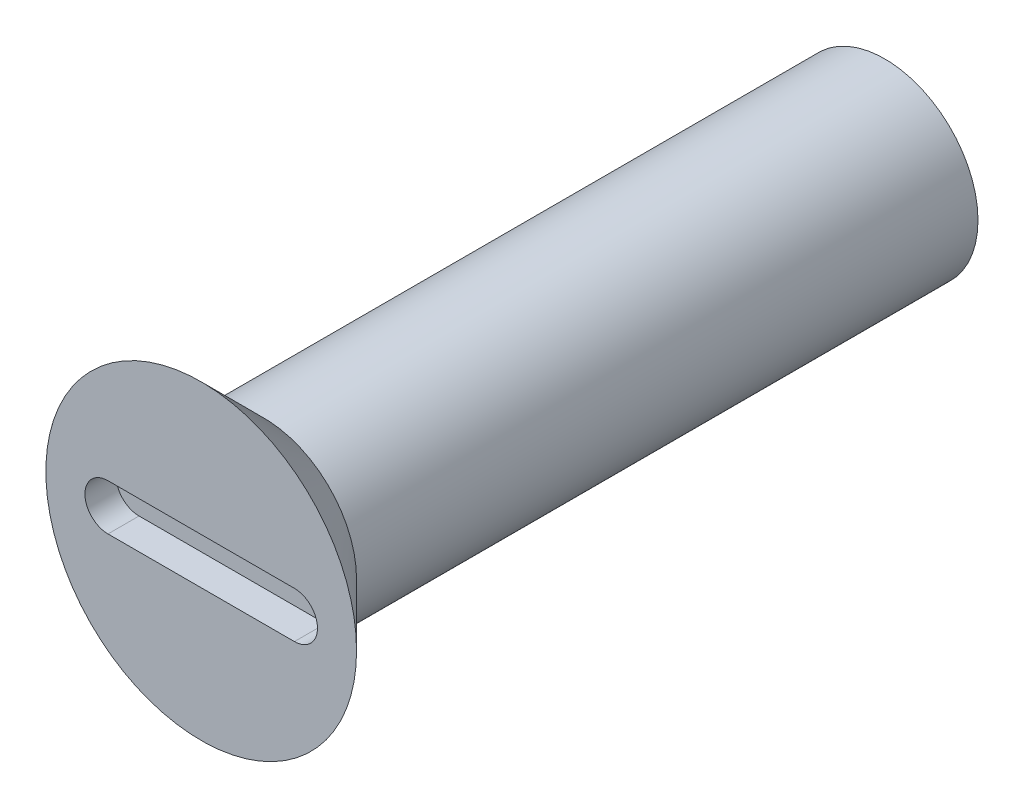
ISO-10303-21;
HEADER;
FILE_DESCRIPTION(('STEP AP214'),'2;1');
FILE_NAME('part.step','',(''),(''),'','','');
FILE_SCHEMA(('AUTOMOTIVE_DESIGN { 1 0 10303 214 1 1 1 1 }'));
ENDSEC;
DATA;
#1=APPLICATION_CONTEXT('core data for automotive mechanical design processes');
#2=APPLICATION_PROTOCOL_DEFINITION('international standard','automotive_design',2000,#1);
#3=PRODUCT_CONTEXT('',#1,'mechanical');
#4=PRODUCT('Part','Part','',(#3));
#5=PRODUCT_RELATED_PRODUCT_CATEGORY('part','',(#4));
#6=PRODUCT_DEFINITION_FORMATION('','',#4);
#7=PRODUCT_DEFINITION_CONTEXT('part definition',#1,'design');
#8=PRODUCT_DEFINITION('design','',#6,#7);
#9=PRODUCT_DEFINITION_SHAPE('','',#8);
#10=(LENGTH_UNIT() NAMED_UNIT(*) SI_UNIT(.MILLI.,.METRE.));
#11=(NAMED_UNIT(*) PLANE_ANGLE_UNIT() SI_UNIT($,.RADIAN.));
#12=(NAMED_UNIT(*) SI_UNIT($,.STERADIAN.) SOLID_ANGLE_UNIT());
#13=UNCERTAINTY_MEASURE_WITH_UNIT(LENGTH_MEASURE(1.E-05),#10,'distance_accuracy_value','');
#14=(GEOMETRIC_REPRESENTATION_CONTEXT(3) GLOBAL_UNCERTAINTY_ASSIGNED_CONTEXT((#13)) GLOBAL_UNIT_ASSIGNED_CONTEXT((#10,
#11,#12)) REPRESENTATION_CONTEXT('',''));
#15=CARTESIAN_POINT('',(0.,0.,0.));
#16=DIRECTION('',(0.,0.,1.));
#17=DIRECTION('',(1.,0.,0.));
#18=AXIS2_PLACEMENT_3D('',#15,#16,#17);
#19=CARTESIAN_POINT('',(0.,0.,10.));
#20=DIRECTION('',(0.,0.,-1.));
#21=DIRECTION('',(-1.,0.,0.));
#22=AXIS2_PLACEMENT_3D('',#19,#20,#21);
#23=CYLINDRICAL_SURFACE('',#22,1.5);
#24=CARTESIAN_POINT('',(0.,0.,10.));
#25=DIRECTION('',(0.,0.,1.));
#26=DIRECTION('',(1.,0.,0.));
#27=AXIS2_PLACEMENT_3D('',#24,#25,#26);
#28=CIRCLE('',#27,1.5);
#29=CARTESIAN_POINT('',(1.5,0.,10.));
#30=VERTEX_POINT('',#29);
#31=EDGE_CURVE('E11',#30,#30,#28,.T.);
#32=ORIENTED_EDGE('',*,*,#31,.F.);
#33=EDGE_LOOP('',(#32));
#34=FACE_BOUND('',#33,.T.);
#35=CARTESIAN_POINT('',(0.,0.,0.));
#36=DIRECTION('',(0.,0.,1.));
#37=DIRECTION('',(1.,0.,0.));
#38=AXIS2_PLACEMENT_3D('',#35,#36,#37);
#39=CIRCLE('',#38,1.5);
#40=CARTESIAN_POINT('',(1.5,0.,0.));
#41=VERTEX_POINT('',#40);
#42=EDGE_CURVE('E48',#41,#41,#39,.T.);
#43=ORIENTED_EDGE('',*,*,#42,.T.);
#44=EDGE_LOOP('',(#43));
#45=FACE_BOUND('',#44,.T.);
#46=ADVANCED_FACE('F45',(#34,#45),#23,.T.);
#47=CARTESIAN_POINT('',(0.,0.,0.));
#48=DIRECTION('',(0.,0.,1.));
#49=DIRECTION('',(1.,0.,0.));
#50=AXIS2_PLACEMENT_3D('',#47,#48,#49);
#51=PLANE('',#50);
#52=ORIENTED_EDGE('',*,*,#42,.F.);
#53=EDGE_LOOP('',(#52));
#54=FACE_BOUND('',#53,.T.);
#55=ADVANCED_FACE('F130',(#54),#51,.F.);
#56=CARTESIAN_POINT('',(0.,0.,10.));
#57=DIRECTION('',(0.,0.,1.));
#58=DIRECTION('',(1.,0.,0.));
#59=AXIS2_PLACEMENT_3D('',#56,#57,#58);
#60=CONICAL_SURFACE('',#59,1.5,0.785398163397454);
#61=CARTESIAN_POINT('',(0.,0.,11.));
#62=DIRECTION('',(0.,0.,1.));
#63=DIRECTION('',(1.,0.,0.));
#64=AXIS2_PLACEMENT_3D('',#61,#62,#63);
#65=CIRCLE('',#64,2.5);
#66=CARTESIAN_POINT('',(2.5,0.,11.));
#67=VERTEX_POINT('',#66);
#68=EDGE_CURVE('E120',#67,#67,#65,.T.);
#69=ORIENTED_EDGE('',*,*,#68,.F.);
#70=EDGE_LOOP('',(#69));
#71=FACE_BOUND('',#70,.T.);
#72=ORIENTED_EDGE('',*,*,#31,.T.);
#73=EDGE_LOOP('',(#72));
#74=FACE_BOUND('',#73,.T.);
#75=ADVANCED_FACE('F132',(#71,#74),#60,.T.);
#76=CARTESIAN_POINT('',(-2.5,0.,11.));
#77=DIRECTION('',(0.,0.,-1.));
#78=DIRECTION('',(-1.,0.,0.));
#79=AXIS2_PLACEMENT_3D('',#76,#77,#78);
#80=PLANE('',#79);
#81=DIRECTION('',(1.,0.,0.));
#82=VECTOR('',#81,1.);
#83=CARTESIAN_POINT('',(-1.5,-0.370893940228979,11.));
#84=LINE('',#83,#82);
#85=CARTESIAN_POINT('',(-1.5,-0.370893940228979,11.));
#86=VERTEX_POINT('',#85);
#87=CARTESIAN_POINT('',(1.5,-0.370893940228979,11.));
#88=VERTEX_POINT('',#87);
#89=EDGE_CURVE('E94',#86,#88,#84,.T.);
#90=ORIENTED_EDGE('',*,*,#89,.F.);
#91=CARTESIAN_POINT('',(-1.5,0.,11.));
#92=DIRECTION('',(0.,0.,1.));
#93=DIRECTION('',(1.,0.,0.));
#94=AXIS2_PLACEMENT_3D('',#91,#92,#93);
#95=CIRCLE('',#94,0.370893940228979);
#96=CARTESIAN_POINT('',(-1.5,0.370893940228979,11.));
#97=VERTEX_POINT('',#96);
#98=EDGE_CURVE('E59',#97,#86,#95,.T.);
#99=ORIENTED_EDGE('',*,*,#98,.F.);
#100=DIRECTION('',(-1.,0.,0.));
#101=VECTOR('',#100,1.);
#102=CARTESIAN_POINT('',(-1.5,0.370893940228979,11.));
#103=LINE('',#102,#101);
#104=CARTESIAN_POINT('',(1.5,0.370893940228979,11.));
#105=VERTEX_POINT('',#104);
#106=EDGE_CURVE('E110',#105,#97,#103,.T.);
#107=ORIENTED_EDGE('',*,*,#106,.F.);
#108=CARTESIAN_POINT('',(1.5,0.,11.));
#109=DIRECTION('',(0.,0.,1.));
#110=DIRECTION('',(1.,0.,0.));
#111=AXIS2_PLACEMENT_3D('',#108,#109,#110);
#112=CIRCLE('',#111,0.370893940228979);
#113=EDGE_CURVE('E116',#88,#105,#112,.T.);
#114=ORIENTED_EDGE('',*,*,#113,.F.);
#115=EDGE_LOOP('',(#90,#99,#107,#114));
#116=FACE_BOUND('',#115,.T.);
#117=ORIENTED_EDGE('',*,*,#68,.T.);
#118=EDGE_LOOP('',(#117));
#119=FACE_BOUND('',#118,.T.);
#120=ADVANCED_FACE('F137',(#116,#119),#80,.F.);
#121=CARTESIAN_POINT('',(-1.5,0.,10.5));
#122=DIRECTION('',(0.,0.,1.));
#123=DIRECTION('',(1.,0.,0.));
#124=AXIS2_PLACEMENT_3D('',#121,#122,#123);
#125=CYLINDRICAL_SURFACE('',#124,0.370893940228979);
#126=ORIENTED_EDGE('',*,*,#98,.T.);
#127=DIRECTION('',(0.,0.,1.));
#128=VECTOR('',#127,1.);
#129=CARTESIAN_POINT('',(-1.5,-0.370893940228979,10.5));
#130=LINE('',#129,#128);
#131=CARTESIAN_POINT('',(-1.5,-0.370893940228979,10.5));
#132=VERTEX_POINT('',#131);
#133=EDGE_CURVE('E82',#132,#86,#130,.T.);
#134=ORIENTED_EDGE('',*,*,#133,.F.);
#135=CARTESIAN_POINT('',(-1.5,0.,10.5));
#136=DIRECTION('',(0.,0.,1.));
#137=DIRECTION('',(1.,0.,0.));
#138=AXIS2_PLACEMENT_3D('',#135,#136,#137);
#139=CIRCLE('',#138,0.370893940228979);
#140=CARTESIAN_POINT('',(-1.5,0.370893940228979,10.5));
#141=VERTEX_POINT('',#140);
#142=EDGE_CURVE('E108',#141,#132,#139,.T.);
#143=ORIENTED_EDGE('',*,*,#142,.F.);
#144=DIRECTION('',(0.,0.,1.));
#145=VECTOR('',#144,1.);
#146=CARTESIAN_POINT('',(-1.5,0.370893940228979,10.5));
#147=LINE('',#146,#145);
#148=EDGE_CURVE('E67',#141,#97,#147,.T.);
#149=ORIENTED_EDGE('',*,*,#148,.T.);
#150=EDGE_LOOP('',(#126,#134,#143,#149));
#151=FACE_BOUND('',#150,.T.);
#152=ADVANCED_FACE('F145',(#151),#125,.F.);
#153=CARTESIAN_POINT('',(-1.5,0.370893940228979,10.5));
#154=DIRECTION('',(0.,1.,0.));
#155=DIRECTION('',(0.,0.,1.));
#156=AXIS2_PLACEMENT_3D('',#153,#154,#155);
#157=PLANE('',#156);
#158=ORIENTED_EDGE('',*,*,#106,.T.);
#159=ORIENTED_EDGE('',*,*,#148,.F.);
#160=DIRECTION('',(-1.,0.,0.));
#161=VECTOR('',#160,1.);
#162=CARTESIAN_POINT('',(-1.5,0.370893940228979,10.5));
#163=LINE('',#162,#161);
#164=CARTESIAN_POINT('',(1.5,0.370893940228979,10.5));
#165=VERTEX_POINT('',#164);
#166=EDGE_CURVE('E105',#165,#141,#163,.T.);
#167=ORIENTED_EDGE('',*,*,#166,.F.);
#168=DIRECTION('',(0.,0.,1.));
#169=VECTOR('',#168,1.);
#170=CARTESIAN_POINT('',(1.5,0.370893940228979,10.5));
#171=LINE('',#170,#169);
#172=EDGE_CURVE('E98',#165,#105,#171,.T.);
#173=ORIENTED_EDGE('',*,*,#172,.T.);
#174=EDGE_LOOP('',(#158,#159,#167,#173));
#175=FACE_BOUND('',#174,.T.);
#176=ADVANCED_FACE('F149',(#175),#157,.F.);
#177=CARTESIAN_POINT('',(1.5,0.,10.5));
#178=DIRECTION('',(0.,0.,1.));
#179=DIRECTION('',(1.,0.,0.));
#180=AXIS2_PLACEMENT_3D('',#177,#178,#179);
#181=CYLINDRICAL_SURFACE('',#180,0.370893940228979);
#182=ORIENTED_EDGE('',*,*,#113,.T.);
#183=ORIENTED_EDGE('',*,*,#172,.F.);
#184=CARTESIAN_POINT('',(1.5,0.,10.5));
#185=DIRECTION('',(0.,0.,1.));
#186=DIRECTION('',(1.,0.,0.));
#187=AXIS2_PLACEMENT_3D('',#184,#185,#186);
#188=CIRCLE('',#187,0.370893940228979);
#189=CARTESIAN_POINT('',(1.5,-0.370893940228979,10.5));
#190=VERTEX_POINT('',#189);
#191=EDGE_CURVE('E101',#190,#165,#188,.T.);
#192=ORIENTED_EDGE('',*,*,#191,.F.);
#193=DIRECTION('',(0.,0.,1.));
#194=VECTOR('',#193,1.);
#195=CARTESIAN_POINT('',(1.5,-0.370893940228979,10.5));
#196=LINE('',#195,#194);
#197=EDGE_CURVE('E87',#190,#88,#196,.T.);
#198=ORIENTED_EDGE('',*,*,#197,.T.);
#199=EDGE_LOOP('',(#182,#183,#192,#198));
#200=FACE_BOUND('',#199,.T.);
#201=ADVANCED_FACE('F102',(#200),#181,.F.);
#202=CARTESIAN_POINT('',(-1.5,-0.370893940228979,10.5));
#203=DIRECTION('',(0.,-1.,0.));
#204=DIRECTION('',(0.,0.,-1.));
#205=AXIS2_PLACEMENT_3D('',#202,#203,#204);
#206=PLANE('',#205);
#207=ORIENTED_EDGE('',*,*,#89,.T.);
#208=ORIENTED_EDGE('',*,*,#197,.F.);
#209=DIRECTION('',(1.,0.,0.));
#210=VECTOR('',#209,1.);
#211=CARTESIAN_POINT('',(-1.5,-0.370893940228979,10.5));
#212=LINE('',#211,#210);
#213=EDGE_CURVE('E91',#132,#190,#212,.T.);
#214=ORIENTED_EDGE('',*,*,#213,.F.);
#215=ORIENTED_EDGE('',*,*,#133,.T.);
#216=EDGE_LOOP('',(#207,#208,#214,#215));
#217=FACE_BOUND('',#216,.T.);
#218=ADVANCED_FACE('F89',(#217),#206,.F.);
#219=CARTESIAN_POINT('',(-1.5,0.,10.5));
#220=DIRECTION('',(0.,0.,1.));
#221=DIRECTION('',(1.,0.,0.));
#222=AXIS2_PLACEMENT_3D('',#219,#220,#221);
#223=PLANE('',#222);
#224=ORIENTED_EDGE('',*,*,#142,.T.);
#225=ORIENTED_EDGE('',*,*,#213,.T.);
#226=ORIENTED_EDGE('',*,*,#191,.T.);
#227=ORIENTED_EDGE('',*,*,#166,.T.);
#228=EDGE_LOOP('',(#224,#225,#226,#227));
#229=FACE_BOUND('',#228,.T.);
#230=ADVANCED_FACE('F107',(#229),#223,.T.);
#231=CLOSED_SHELL('',(#46,#55,#75,#120,#152,#176,#201,#218,#230));
#232=MANIFOLD_SOLID_BREP('B2',#231);
#233=ADVANCED_BREP_SHAPE_REPRESENTATION('',(#18,#232),#14);
#234=SHAPE_DEFINITION_REPRESENTATION(#9,#233);
ENDSEC;
END-ISO-10303-21;
